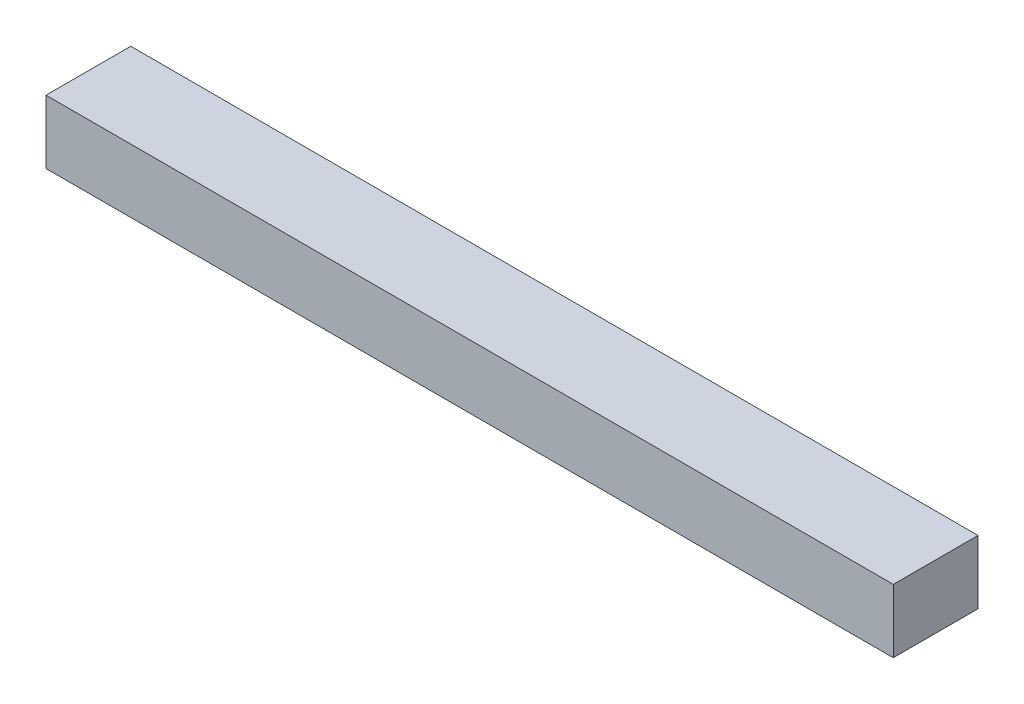
ISO-10303-21;
HEADER;
FILE_DESCRIPTION(('STEP AP214'),'2;1');
FILE_NAME('part.step','',(''),(''),'','','');
FILE_SCHEMA(('AUTOMOTIVE_DESIGN { 1 0 10303 214 1 1 1 1 }'));
ENDSEC;
DATA;
#1=APPLICATION_CONTEXT('core data for automotive mechanical design processes');
#2=APPLICATION_PROTOCOL_DEFINITION('international standard','automotive_design',2000,#1);
#3=PRODUCT_CONTEXT('',#1,'mechanical');
#4=PRODUCT('Part','Part','',(#3));
#5=PRODUCT_RELATED_PRODUCT_CATEGORY('part','',(#4));
#6=PRODUCT_DEFINITION_FORMATION('','',#4);
#7=PRODUCT_DEFINITION_CONTEXT('part definition',#1,'design');
#8=PRODUCT_DEFINITION('design','',#6,#7);
#9=PRODUCT_DEFINITION_SHAPE('','',#8);
#10=(LENGTH_UNIT() NAMED_UNIT(*) SI_UNIT(.MILLI.,.METRE.));
#11=(NAMED_UNIT(*) PLANE_ANGLE_UNIT() SI_UNIT($,.RADIAN.));
#12=(NAMED_UNIT(*) SI_UNIT($,.STERADIAN.) SOLID_ANGLE_UNIT());
#13=UNCERTAINTY_MEASURE_WITH_UNIT(LENGTH_MEASURE(1.E-05),#10,'distance_accuracy_value','');
#14=(GEOMETRIC_REPRESENTATION_CONTEXT(3) GLOBAL_UNCERTAINTY_ASSIGNED_CONTEXT((#13)) GLOBAL_UNIT_ASSIGNED_CONTEXT((#10,
#11,#12)) REPRESENTATION_CONTEXT('',''));
#15=CARTESIAN_POINT('',(0.,0.,0.));
#16=DIRECTION('',(0.,0.,1.));
#17=DIRECTION('',(1.,0.,0.));
#18=AXIS2_PLACEMENT_3D('',#15,#16,#17);
#19=CARTESIAN_POINT('',(0.,-3.04771133363467,1.));
#20=DIRECTION('',(1.,0.,0.));
#21=DIRECTION('',(0.,0.,-1.));
#22=AXIS2_PLACEMENT_3D('',#19,#20,#21);
#23=PLANE('',#22);
#24=DIRECTION('',(0.,-1.,0.));
#25=VECTOR('',#24,1.);
#26=CARTESIAN_POINT('',(0.,-3.04771133363467,0.));
#27=LINE('',#26,#25);
#28=CARTESIAN_POINT('',(0.,-2.29771133363467,0.));
#29=VERTEX_POINT('',#28);
#30=CARTESIAN_POINT('',(0.,-3.04771133363467,0.));
#31=VERTEX_POINT('',#30);
#32=EDGE_CURVE('E100',#29,#31,#27,.T.);
#33=ORIENTED_EDGE('',*,*,#32,.T.);
#34=DIRECTION('',(0.,0.,-1.));
#35=VECTOR('',#34,1.);
#36=CARTESIAN_POINT('',(0.,-3.04771133363467,1.));
#37=LINE('',#36,#35);
#38=CARTESIAN_POINT('',(0.,-3.04771133363467,1.));
#39=VERTEX_POINT('',#38);
#40=EDGE_CURVE('E11',#39,#31,#37,.T.);
#41=ORIENTED_EDGE('',*,*,#40,.F.);
#42=DIRECTION('',(0.,-1.,0.));
#43=VECTOR('',#42,1.);
#44=CARTESIAN_POINT('',(0.,-3.04771133363467,1.));
#45=LINE('',#44,#43);
#46=CARTESIAN_POINT('',(0.,-2.29771133363467,1.));
#47=VERTEX_POINT('',#46);
#48=EDGE_CURVE('E88',#47,#39,#45,.T.);
#49=ORIENTED_EDGE('',*,*,#48,.F.);
#50=DIRECTION('',(0.,0.,-1.));
#51=VECTOR('',#50,1.);
#52=CARTESIAN_POINT('',(0.,-2.29771133363467,1.));
#53=LINE('',#52,#51);
#54=EDGE_CURVE('E96',#47,#29,#53,.T.);
#55=ORIENTED_EDGE('',*,*,#54,.T.);
#56=EDGE_LOOP('',(#33,#41,#49,#55));
#57=FACE_BOUND('',#56,.T.);
#58=ADVANCED_FACE('F37',(#57),#23,.F.);
#59=CARTESIAN_POINT('',(0.,-3.04771133363467,1.));
#60=DIRECTION('',(0.,1.,0.));
#61=DIRECTION('',(0.,0.,1.));
#62=AXIS2_PLACEMENT_3D('',#59,#60,#61);
#63=PLANE('',#62);
#64=DIRECTION('',(1.,0.,0.));
#65=VECTOR('',#64,1.);
#66=CARTESIAN_POINT('',(0.,-3.04771133363467,0.));
#67=LINE('',#66,#65);
#68=CARTESIAN_POINT('',(10.,-3.04771133363467,0.));
#69=VERTEX_POINT('',#68);
#70=EDGE_CURVE('E92',#31,#69,#67,.T.);
#71=ORIENTED_EDGE('',*,*,#70,.T.);
#72=DIRECTION('',(0.,0.,-1.));
#73=VECTOR('',#72,1.);
#74=CARTESIAN_POINT('',(10.,-3.04771133363467,1.));
#75=LINE('',#74,#73);
#76=CARTESIAN_POINT('',(10.,-3.04771133363467,1.));
#77=VERTEX_POINT('',#76);
#78=EDGE_CURVE('E45',#77,#69,#75,.T.);
#79=ORIENTED_EDGE('',*,*,#78,.F.);
#80=DIRECTION('',(1.,0.,0.));
#81=VECTOR('',#80,1.);
#82=CARTESIAN_POINT('',(0.,-3.04771133363467,1.));
#83=LINE('',#82,#81);
#84=EDGE_CURVE('E83',#39,#77,#83,.T.);
#85=ORIENTED_EDGE('',*,*,#84,.F.);
#86=ORIENTED_EDGE('',*,*,#40,.T.);
#87=EDGE_LOOP('',(#71,#79,#85,#86));
#88=FACE_BOUND('',#87,.T.);
#89=ADVANCED_FACE('F91',(#88),#63,.F.);
#90=CARTESIAN_POINT('',(10.,-3.04771133363467,1.));
#91=DIRECTION('',(-1.,0.,0.));
#92=DIRECTION('',(0.,0.,1.));
#93=AXIS2_PLACEMENT_3D('',#90,#91,#92);
#94=PLANE('',#93);
#95=DIRECTION('',(0.,1.,0.));
#96=VECTOR('',#95,1.);
#97=CARTESIAN_POINT('',(10.,-3.04771133363467,0.));
#98=LINE('',#97,#96);
#99=CARTESIAN_POINT('',(10.,-2.29771133363467,0.));
#100=VERTEX_POINT('',#99);
#101=EDGE_CURVE('E70',#69,#100,#98,.T.);
#102=ORIENTED_EDGE('',*,*,#101,.T.);
#103=DIRECTION('',(0.,0.,-1.));
#104=VECTOR('',#103,1.);
#105=CARTESIAN_POINT('',(10.,-2.29771133363467,1.));
#106=LINE('',#105,#104);
#107=CARTESIAN_POINT('',(10.,-2.29771133363467,1.));
#108=VERTEX_POINT('',#107);
#109=EDGE_CURVE('E93',#108,#100,#106,.T.);
#110=ORIENTED_EDGE('',*,*,#109,.F.);
#111=DIRECTION('',(0.,1.,0.));
#112=VECTOR('',#111,1.);
#113=CARTESIAN_POINT('',(10.,-3.04771133363467,1.));
#114=LINE('',#113,#112);
#115=EDGE_CURVE('E86',#77,#108,#114,.T.);
#116=ORIENTED_EDGE('',*,*,#115,.F.);
#117=ORIENTED_EDGE('',*,*,#78,.T.);
#118=EDGE_LOOP('',(#102,#110,#116,#117));
#119=FACE_BOUND('',#118,.T.);
#120=ADVANCED_FACE('F94',(#119),#94,.F.);
#121=CARTESIAN_POINT('',(0.,-2.29771133363467,1.));
#122=DIRECTION('',(0.,-1.,0.));
#123=DIRECTION('',(0.,0.,-1.));
#124=AXIS2_PLACEMENT_3D('',#121,#122,#123);
#125=PLANE('',#124);
#126=DIRECTION('',(-1.,0.,0.));
#127=VECTOR('',#126,1.);
#128=CARTESIAN_POINT('',(0.,-2.29771133363467,0.));
#129=LINE('',#128,#127);
#130=EDGE_CURVE('E76',#100,#29,#129,.T.);
#131=ORIENTED_EDGE('',*,*,#130,.T.);
#132=ORIENTED_EDGE('',*,*,#54,.F.);
#133=DIRECTION('',(-1.,0.,0.));
#134=VECTOR('',#133,1.);
#135=CARTESIAN_POINT('',(0.,-2.29771133363467,1.));
#136=LINE('',#135,#134);
#137=EDGE_CURVE('E53',#108,#47,#136,.T.);
#138=ORIENTED_EDGE('',*,*,#137,.F.);
#139=ORIENTED_EDGE('',*,*,#109,.T.);
#140=EDGE_LOOP('',(#131,#132,#138,#139));
#141=FACE_BOUND('',#140,.T.);
#142=ADVANCED_FACE('F107',(#141),#125,.F.);
#143=CARTESIAN_POINT('',(0.,-2.29771133363467,1.));
#144=DIRECTION('',(0.,0.,-1.));
#145=DIRECTION('',(-1.,0.,0.));
#146=AXIS2_PLACEMENT_3D('',#143,#144,#145);
#147=PLANE('',#146);
#148=ORIENTED_EDGE('',*,*,#48,.T.);
#149=ORIENTED_EDGE('',*,*,#84,.T.);
#150=ORIENTED_EDGE('',*,*,#115,.T.);
#151=ORIENTED_EDGE('',*,*,#137,.T.);
#152=EDGE_LOOP('',(#148,#149,#150,#151));
#153=FACE_BOUND('',#152,.T.);
#154=ADVANCED_FACE('F84',(#153),#147,.F.);
#155=CARTESIAN_POINT('',(0.,-2.29771133363467,0.));
#156=DIRECTION('',(0.,0.,-1.));
#157=DIRECTION('',(-1.,0.,0.));
#158=AXIS2_PLACEMENT_3D('',#155,#156,#157);
#159=PLANE('',#158);
#160=ORIENTED_EDGE('',*,*,#32,.F.);
#161=ORIENTED_EDGE('',*,*,#130,.F.);
#162=ORIENTED_EDGE('',*,*,#101,.F.);
#163=ORIENTED_EDGE('',*,*,#70,.F.);
#164=EDGE_LOOP('',(#160,#161,#162,#163));
#165=FACE_BOUND('',#164,.T.);
#166=ADVANCED_FACE('F110',(#165),#159,.T.);
#167=CLOSED_SHELL('',(#58,#89,#120,#142,#154,#166));
#168=MANIFOLD_SOLID_BREP('B2',#167);
#169=ADVANCED_BREP_SHAPE_REPRESENTATION('',(#18,#168),#14);
#170=SHAPE_DEFINITION_REPRESENTATION(#9,#169);
ENDSEC;
END-ISO-10303-21;
